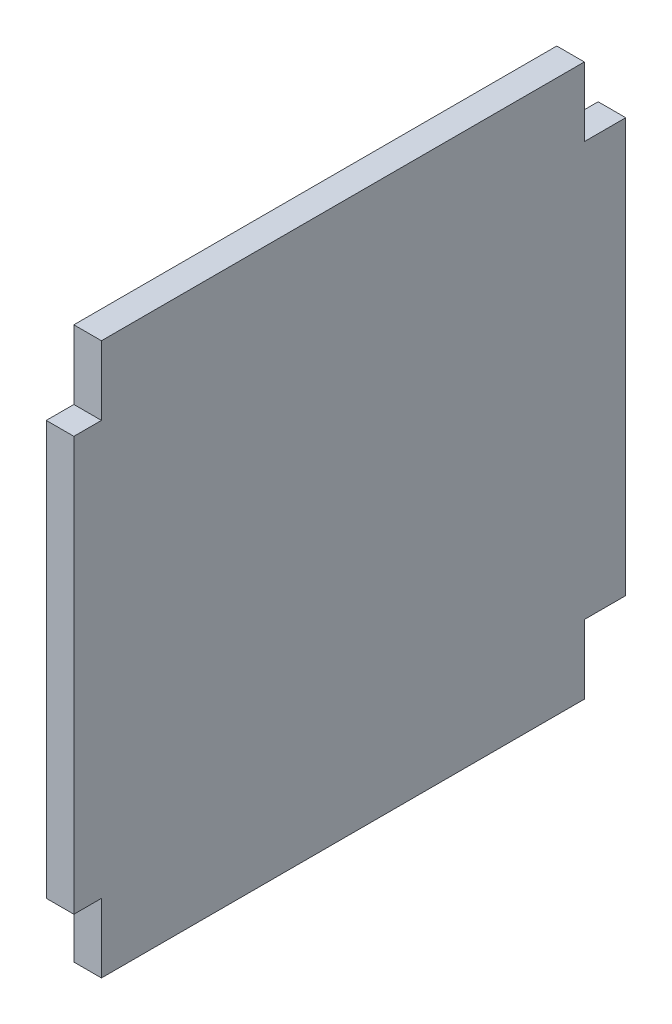
ISO-10303-21;
HEADER;
FILE_DESCRIPTION(('STEP AP214'),'2;1');
FILE_NAME('part.step','',(''),(''),'','','');
FILE_SCHEMA(('AUTOMOTIVE_DESIGN { 1 0 10303 214 1 1 1 1 }'));
ENDSEC;
DATA;
#1=APPLICATION_CONTEXT('core data for automotive mechanical design processes');
#2=APPLICATION_PROTOCOL_DEFINITION('international standard','automotive_design',2000,#1);
#3=PRODUCT_CONTEXT('',#1,'mechanical');
#4=PRODUCT('Part','Part','',(#3));
#5=PRODUCT_RELATED_PRODUCT_CATEGORY('part','',(#4));
#6=PRODUCT_DEFINITION_FORMATION('','',#4);
#7=PRODUCT_DEFINITION_CONTEXT('part definition',#1,'design');
#8=PRODUCT_DEFINITION('design','',#6,#7);
#9=PRODUCT_DEFINITION_SHAPE('','',#8);
#10=(LENGTH_UNIT() NAMED_UNIT(*) SI_UNIT(.MILLI.,.METRE.));
#11=(NAMED_UNIT(*) PLANE_ANGLE_UNIT() SI_UNIT($,.RADIAN.));
#12=(NAMED_UNIT(*) SI_UNIT($,.STERADIAN.) SOLID_ANGLE_UNIT());
#13=UNCERTAINTY_MEASURE_WITH_UNIT(LENGTH_MEASURE(1.E-05),#10,'distance_accuracy_value','');
#14=(GEOMETRIC_REPRESENTATION_CONTEXT(3) GLOBAL_UNCERTAINTY_ASSIGNED_CONTEXT((#13)) GLOBAL_UNIT_ASSIGNED_CONTEXT((#10,
#11,#12)) REPRESENTATION_CONTEXT('',''));
#15=CARTESIAN_POINT('',(0.,0.,0.));
#16=DIRECTION('',(0.,0.,1.));
#17=DIRECTION('',(1.,0.,0.));
#18=AXIS2_PLACEMENT_3D('',#15,#16,#17);
#19=CARTESIAN_POINT('',(214.,15.,67.0665927567458));
#20=DIRECTION('',(0.,-1.,0.));
#21=DIRECTION('',(0.,0.,-1.));
#22=AXIS2_PLACEMENT_3D('',#19,#20,#21);
#23=PLANE('',#22);
#24=DIRECTION('',(0.,0.,-1.));
#25=VECTOR('',#24,1.);
#26=CARTESIAN_POINT('',(216.,15.,67.0665927567458));
#27=LINE('',#26,#25);
#28=CARTESIAN_POINT('',(216.,15.,37.));
#29=VERTEX_POINT('',#28);
#30=CARTESIAN_POINT('',(216.,15.,35.));
#31=VERTEX_POINT('',#30);
#32=EDGE_CURVE('E174',#29,#31,#27,.T.);
#33=ORIENTED_EDGE('',*,*,#32,.T.);
#34=DIRECTION('',(-1.,0.,0.));
#35=VECTOR('',#34,1.);
#36=CARTESIAN_POINT('',(216.,15.,35.));
#37=LINE('',#36,#35);
#38=CARTESIAN_POINT('',(214.,15.,35.));
#39=VERTEX_POINT('',#38);
#40=EDGE_CURVE('E142',#31,#39,#37,.T.);
#41=ORIENTED_EDGE('',*,*,#40,.T.);
#42=DIRECTION('',(0.,0.,-1.));
#43=VECTOR('',#42,1.);
#44=CARTESIAN_POINT('',(214.,15.,67.0665927567458));
#45=LINE('',#44,#43);
#46=CARTESIAN_POINT('',(214.,15.,37.));
#47=VERTEX_POINT('',#46);
#48=EDGE_CURVE('E201',#47,#39,#45,.T.);
#49=ORIENTED_EDGE('',*,*,#48,.F.);
#50=DIRECTION('',(-1.,0.,0.));
#51=VECTOR('',#50,1.);
#52=CARTESIAN_POINT('',(214.,15.,37.));
#53=LINE('',#52,#51);
#54=EDGE_CURVE('E181',#29,#47,#53,.T.);
#55=ORIENTED_EDGE('',*,*,#54,.F.);
#56=EDGE_LOOP('',(#33,#41,#49,#55));
#57=FACE_BOUND('',#56,.T.);
#58=ADVANCED_FACE('F33',(#57),#23,.F.);
#59=CARTESIAN_POINT('',(214.,-15.,67.0665927567458));
#60=DIRECTION('',(0.,1.,0.));
#61=DIRECTION('',(0.,0.,1.));
#62=AXIS2_PLACEMENT_3D('',#59,#60,#61);
#63=PLANE('',#62);
#64=DIRECTION('',(1.,0.,0.));
#65=VECTOR('',#64,1.);
#66=CARTESIAN_POINT('',(216.,-15.,0.));
#67=LINE('',#66,#65);
#68=CARTESIAN_POINT('',(214.,-15.,0.));
#69=VERTEX_POINT('',#68);
#70=CARTESIAN_POINT('',(216.,-15.,0.));
#71=VERTEX_POINT('',#70);
#72=EDGE_CURVE('E230',#69,#71,#67,.T.);
#73=ORIENTED_EDGE('',*,*,#72,.F.);
#74=DIRECTION('',(0.,0.,-1.));
#75=VECTOR('',#74,1.);
#76=CARTESIAN_POINT('',(214.,-15.,67.0665927567458));
#77=LINE('',#76,#75);
#78=CARTESIAN_POINT('',(214.,-15.,-3.));
#79=VERTEX_POINT('',#78);
#80=EDGE_CURVE('E202',#69,#79,#77,.T.);
#81=ORIENTED_EDGE('',*,*,#80,.T.);
#82=DIRECTION('',(-1.,0.,0.));
#83=VECTOR('',#82,1.);
#84=CARTESIAN_POINT('',(214.,-15.,-3.));
#85=LINE('',#84,#83);
#86=CARTESIAN_POINT('',(216.,-15.,-3.));
#87=VERTEX_POINT('',#86);
#88=EDGE_CURVE('E205',#87,#79,#85,.T.);
#89=ORIENTED_EDGE('',*,*,#88,.F.);
#90=DIRECTION('',(0.,0.,-1.));
#91=VECTOR('',#90,1.);
#92=CARTESIAN_POINT('',(216.,-15.,67.0665927567458));
#93=LINE('',#92,#91);
#94=EDGE_CURVE('E58',#71,#87,#93,.T.);
#95=ORIENTED_EDGE('',*,*,#94,.F.);
#96=EDGE_LOOP('',(#73,#81,#89,#95));
#97=FACE_BOUND('',#96,.T.);
#98=ADVANCED_FACE('F274',(#97),#63,.F.);
#99=DIRECTION('',(-1.,0.,0.));
#100=VECTOR('',#99,1.);
#101=CARTESIAN_POINT('',(216.,-15.,35.));
#102=LINE('',#101,#100);
#103=CARTESIAN_POINT('',(216.,-15.,35.));
#104=VERTEX_POINT('',#103);
#105=CARTESIAN_POINT('',(214.,-15.,35.));
#106=VERTEX_POINT('',#105);
#107=EDGE_CURVE('E131',#104,#106,#102,.T.);
#108=ORIENTED_EDGE('',*,*,#107,.F.);
#109=CARTESIAN_POINT('',(216.,-15.,37.));
#110=VERTEX_POINT('',#109);
#111=EDGE_CURVE('E185',#110,#104,#93,.T.);
#112=ORIENTED_EDGE('',*,*,#111,.F.);
#113=DIRECTION('',(1.,0.,0.));
#114=VECTOR('',#113,1.);
#115=CARTESIAN_POINT('',(214.,-15.,37.));
#116=LINE('',#115,#114);
#117=CARTESIAN_POINT('',(214.,-15.,37.));
#118=VERTEX_POINT('',#117);
#119=EDGE_CURVE('E42',#118,#110,#116,.T.);
#120=ORIENTED_EDGE('',*,*,#119,.F.);
#121=EDGE_CURVE('E198',#118,#106,#77,.T.);
#122=ORIENTED_EDGE('',*,*,#121,.T.);
#123=EDGE_LOOP('',(#108,#112,#120,#122));
#124=FACE_BOUND('',#123,.T.);
#125=ADVANCED_FACE('F283',(#124),#63,.F.);
#126=CARTESIAN_POINT('',(214.,15.,67.0665927567458));
#127=DIRECTION('',(1.,0.,0.));
#128=DIRECTION('',(0.,0.,-1.));
#129=AXIS2_PLACEMENT_3D('',#126,#127,#128);
#130=PLANE('',#129);
#131=DIRECTION('',(0.,-1.,0.));
#132=VECTOR('',#131,1.);
#133=CARTESIAN_POINT('',(214.,15.,37.));
#134=LINE('',#133,#132);
#135=EDGE_CURVE('E183',#47,#118,#134,.T.);
#136=ORIENTED_EDGE('',*,*,#135,.F.);
#137=ORIENTED_EDGE('',*,*,#48,.T.);
#138=DIRECTION('',(0.,-1.,0.));
#139=VECTOR('',#138,1.);
#140=CARTESIAN_POINT('',(214.,20.,35.));
#141=LINE('',#140,#139);
#142=CARTESIAN_POINT('',(214.,20.,35.));
#143=VERTEX_POINT('',#142);
#144=EDGE_CURVE('E165',#143,#39,#141,.T.);
#145=ORIENTED_EDGE('',*,*,#144,.F.);
#146=DIRECTION('',(0.,0.,-1.));
#147=VECTOR('',#146,1.);
#148=CARTESIAN_POINT('',(214.,20.,0.));
#149=LINE('',#148,#147);
#150=CARTESIAN_POINT('',(214.,20.,0.));
#151=VERTEX_POINT('',#150);
#152=EDGE_CURVE('E145',#143,#151,#149,.T.);
#153=ORIENTED_EDGE('',*,*,#152,.T.);
#154=DIRECTION('',(0.,-1.,0.));
#155=VECTOR('',#154,1.);
#156=CARTESIAN_POINT('',(214.,20.,0.));
#157=LINE('',#156,#155);
#158=CARTESIAN_POINT('',(214.,15.,0.));
#159=VERTEX_POINT('',#158);
#160=EDGE_CURVE('E132',#151,#159,#157,.T.);
#161=ORIENTED_EDGE('',*,*,#160,.T.);
#162=CARTESIAN_POINT('',(214.,15.,-3.));
#163=VERTEX_POINT('',#162);
#164=EDGE_CURVE('E158',#159,#163,#45,.T.);
#165=ORIENTED_EDGE('',*,*,#164,.T.);
#166=DIRECTION('',(0.,1.,0.));
#167=VECTOR('',#166,1.);
#168=CARTESIAN_POINT('',(214.,15.,-3.));
#169=LINE('',#168,#167);
#170=EDGE_CURVE('E210',#79,#163,#169,.T.);
#171=ORIENTED_EDGE('',*,*,#170,.F.);
#172=ORIENTED_EDGE('',*,*,#80,.F.);
#173=DIRECTION('',(0.,1.,0.));
#174=VECTOR('',#173,1.);
#175=CARTESIAN_POINT('',(214.,-20.,0.));
#176=LINE('',#175,#174);
#177=CARTESIAN_POINT('',(214.,-20.,0.));
#178=VERTEX_POINT('',#177);
#179=EDGE_CURVE('E250',#178,#69,#176,.T.);
#180=ORIENTED_EDGE('',*,*,#179,.F.);
#181=DIRECTION('',(0.,0.,-1.));
#182=VECTOR('',#181,1.);
#183=CARTESIAN_POINT('',(214.,-20.,0.));
#184=LINE('',#183,#182);
#185=CARTESIAN_POINT('',(214.,-20.,35.));
#186=VERTEX_POINT('',#185);
#187=EDGE_CURVE('E276',#186,#178,#184,.T.);
#188=ORIENTED_EDGE('',*,*,#187,.F.);
#189=DIRECTION('',(0.,1.,0.));
#190=VECTOR('',#189,1.);
#191=CARTESIAN_POINT('',(214.,-20.,35.));
#192=LINE('',#191,#190);
#193=EDGE_CURVE('E231',#186,#106,#192,.T.);
#194=ORIENTED_EDGE('',*,*,#193,.T.);
#195=ORIENTED_EDGE('',*,*,#121,.F.);
#196=EDGE_LOOP('',(#136,#137,#145,#153,#161,#165,#171,#172,#180,#188,#194,#195));
#197=FACE_BOUND('',#196,.T.);
#198=ADVANCED_FACE('F275',(#197),#130,.F.);
#199=CARTESIAN_POINT('',(216.,15.,67.0665927567458));
#200=DIRECTION('',(-1.,0.,0.));
#201=DIRECTION('',(0.,0.,1.));
#202=AXIS2_PLACEMENT_3D('',#199,#200,#201);
#203=PLANE('',#202);
#204=DIRECTION('',(0.,1.,0.));
#205=VECTOR('',#204,1.);
#206=CARTESIAN_POINT('',(216.,15.,37.));
#207=LINE('',#206,#205);
#208=EDGE_CURVE('E11',#110,#29,#207,.T.);
#209=ORIENTED_EDGE('',*,*,#208,.F.);
#210=ORIENTED_EDGE('',*,*,#111,.T.);
#211=DIRECTION('',(0.,1.,0.));
#212=VECTOR('',#211,1.);
#213=CARTESIAN_POINT('',(216.,-20.,35.));
#214=LINE('',#213,#212);
#215=CARTESIAN_POINT('',(216.,-20.,35.));
#216=VERTEX_POINT('',#215);
#217=EDGE_CURVE('E257',#216,#104,#214,.T.);
#218=ORIENTED_EDGE('',*,*,#217,.F.);
#219=DIRECTION('',(0.,0.,1.));
#220=VECTOR('',#219,1.);
#221=CARTESIAN_POINT('',(216.,-20.,0.));
#222=LINE('',#221,#220);
#223=CARTESIAN_POINT('',(216.,-20.,0.));
#224=VERTEX_POINT('',#223);
#225=EDGE_CURVE('E244',#224,#216,#222,.T.);
#226=ORIENTED_EDGE('',*,*,#225,.F.);
#227=DIRECTION('',(0.,1.,0.));
#228=VECTOR('',#227,1.);
#229=CARTESIAN_POINT('',(216.,-20.,0.));
#230=LINE('',#229,#228);
#231=EDGE_CURVE('E247',#224,#71,#230,.T.);
#232=ORIENTED_EDGE('',*,*,#231,.T.);
#233=ORIENTED_EDGE('',*,*,#94,.T.);
#234=DIRECTION('',(0.,-1.,0.));
#235=VECTOR('',#234,1.);
#236=CARTESIAN_POINT('',(216.,15.,-3.));
#237=LINE('',#236,#235);
#238=CARTESIAN_POINT('',(216.,15.,-3.));
#239=VERTEX_POINT('',#238);
#240=EDGE_CURVE('E240',#239,#87,#237,.T.);
#241=ORIENTED_EDGE('',*,*,#240,.F.);
#242=CARTESIAN_POINT('',(216.,15.,0.));
#243=VERTEX_POINT('',#242);
#244=EDGE_CURVE('E130',#243,#239,#27,.T.);
#245=ORIENTED_EDGE('',*,*,#244,.F.);
#246=DIRECTION('',(0.,-1.,0.));
#247=VECTOR('',#246,1.);
#248=CARTESIAN_POINT('',(216.,20.,0.));
#249=LINE('',#248,#247);
#250=CARTESIAN_POINT('',(216.,20.,0.));
#251=VERTEX_POINT('',#250);
#252=EDGE_CURVE('E50',#251,#243,#249,.T.);
#253=ORIENTED_EDGE('',*,*,#252,.F.);
#254=DIRECTION('',(0.,0.,1.));
#255=VECTOR('',#254,1.);
#256=CARTESIAN_POINT('',(216.,20.,0.));
#257=LINE('',#256,#255);
#258=CARTESIAN_POINT('',(216.,20.,35.));
#259=VERTEX_POINT('',#258);
#260=EDGE_CURVE('E127',#251,#259,#257,.T.);
#261=ORIENTED_EDGE('',*,*,#260,.T.);
#262=DIRECTION('',(0.,-1.,0.));
#263=VECTOR('',#262,1.);
#264=CARTESIAN_POINT('',(216.,20.,35.));
#265=LINE('',#264,#263);
#266=EDGE_CURVE('E150',#259,#31,#265,.T.);
#267=ORIENTED_EDGE('',*,*,#266,.T.);
#268=ORIENTED_EDGE('',*,*,#32,.F.);
#269=EDGE_LOOP('',(#209,#210,#218,#226,#232,#233,#241,#245,#253,#261,#267,#268));
#270=FACE_BOUND('',#269,.T.);
#271=ADVANCED_FACE('F126',(#270),#203,.F.);
#272=ORIENTED_EDGE('',*,*,#164,.F.);
#273=DIRECTION('',(1.,0.,0.));
#274=VECTOR('',#273,1.);
#275=CARTESIAN_POINT('',(216.,15.,0.));
#276=LINE('',#275,#274);
#277=EDGE_CURVE('E156',#159,#243,#276,.T.);
#278=ORIENTED_EDGE('',*,*,#277,.T.);
#279=ORIENTED_EDGE('',*,*,#244,.T.);
#280=DIRECTION('',(1.,0.,0.));
#281=VECTOR('',#280,1.);
#282=CARTESIAN_POINT('',(214.,15.,-3.));
#283=LINE('',#282,#281);
#284=EDGE_CURVE('E214',#163,#239,#283,.T.);
#285=ORIENTED_EDGE('',*,*,#284,.F.);
#286=EDGE_LOOP('',(#272,#278,#279,#285));
#287=FACE_BOUND('',#286,.T.);
#288=ADVANCED_FACE('F296',(#287),#23,.F.);
#289=CARTESIAN_POINT('',(144.,0.,37.));
#290=DIRECTION('',(0.,0.,1.));
#291=DIRECTION('',(-1.,0.,0.));
#292=AXIS2_PLACEMENT_3D('',#289,#290,#291);
#293=PLANE('',#292);
#294=ORIENTED_EDGE('',*,*,#54,.T.);
#295=ORIENTED_EDGE('',*,*,#135,.T.);
#296=ORIENTED_EDGE('',*,*,#119,.T.);
#297=ORIENTED_EDGE('',*,*,#208,.T.);
#298=EDGE_LOOP('',(#294,#295,#296,#297));
#299=FACE_BOUND('',#298,.T.);
#300=ADVANCED_FACE('F35',(#299),#293,.T.);
#301=CARTESIAN_POINT('',(0.,0.,-3.));
#302=DIRECTION('',(0.,0.,1.));
#303=DIRECTION('',(0.,-1.,0.));
#304=AXIS2_PLACEMENT_3D('',#301,#302,#303);
#305=PLANE('',#304);
#306=ORIENTED_EDGE('',*,*,#170,.T.);
#307=ORIENTED_EDGE('',*,*,#284,.T.);
#308=ORIENTED_EDGE('',*,*,#240,.T.);
#309=ORIENTED_EDGE('',*,*,#88,.T.);
#310=EDGE_LOOP('',(#306,#307,#308,#309));
#311=FACE_BOUND('',#310,.T.);
#312=ADVANCED_FACE('F267',(#311),#305,.F.);
#313=CARTESIAN_POINT('',(216.,-20.,35.));
#314=DIRECTION('',(0.,0.,-1.));
#315=DIRECTION('',(-1.,0.,0.));
#316=AXIS2_PLACEMENT_3D('',#313,#314,#315);
#317=PLANE('',#316);
#318=ORIENTED_EDGE('',*,*,#107,.T.);
#319=ORIENTED_EDGE('',*,*,#193,.F.);
#320=DIRECTION('',(-1.,0.,0.));
#321=VECTOR('',#320,1.);
#322=CARTESIAN_POINT('',(216.,-20.,35.));
#323=LINE('',#322,#321);
#324=EDGE_CURVE('E278',#216,#186,#323,.T.);
#325=ORIENTED_EDGE('',*,*,#324,.F.);
#326=ORIENTED_EDGE('',*,*,#217,.T.);
#327=EDGE_LOOP('',(#318,#319,#325,#326));
#328=FACE_BOUND('',#327,.T.);
#329=ADVANCED_FACE('F285',(#328),#317,.F.);
#330=CARTESIAN_POINT('',(216.,-20.,0.));
#331=DIRECTION('',(0.,0.,1.));
#332=DIRECTION('',(1.,0.,0.));
#333=AXIS2_PLACEMENT_3D('',#330,#331,#332);
#334=PLANE('',#333);
#335=ORIENTED_EDGE('',*,*,#72,.T.);
#336=ORIENTED_EDGE('',*,*,#231,.F.);
#337=DIRECTION('',(1.,0.,0.));
#338=VECTOR('',#337,1.);
#339=CARTESIAN_POINT('',(216.,-20.,0.));
#340=LINE('',#339,#338);
#341=EDGE_CURVE('E236',#178,#224,#340,.T.);
#342=ORIENTED_EDGE('',*,*,#341,.F.);
#343=ORIENTED_EDGE('',*,*,#179,.T.);
#344=EDGE_LOOP('',(#335,#336,#342,#343));
#345=FACE_BOUND('',#344,.T.);
#346=ADVANCED_FACE('F272',(#345),#334,.F.);
#347=CARTESIAN_POINT('',(0.,-20.,0.));
#348=DIRECTION('',(0.,-1.,0.));
#349=DIRECTION('',(0.,0.,-1.));
#350=AXIS2_PLACEMENT_3D('',#347,#348,#349);
#351=PLANE('',#350);
#352=ORIENTED_EDGE('',*,*,#225,.T.);
#353=ORIENTED_EDGE('',*,*,#324,.T.);
#354=ORIENTED_EDGE('',*,*,#187,.T.);
#355=ORIENTED_EDGE('',*,*,#341,.T.);
#356=EDGE_LOOP('',(#352,#353,#354,#355));
#357=FACE_BOUND('',#356,.T.);
#358=ADVANCED_FACE('F280',(#357),#351,.T.);
#359=CARTESIAN_POINT('',(216.,20.,0.));
#360=DIRECTION('',(0.,0.,-1.));
#361=DIRECTION('',(-1.,0.,0.));
#362=AXIS2_PLACEMENT_3D('',#359,#360,#361);
#363=PLANE('',#362);
#364=ORIENTED_EDGE('',*,*,#277,.F.);
#365=ORIENTED_EDGE('',*,*,#160,.F.);
#366=DIRECTION('',(1.,0.,0.));
#367=VECTOR('',#366,1.);
#368=CARTESIAN_POINT('',(216.,20.,0.));
#369=LINE('',#368,#367);
#370=EDGE_CURVE('E138',#151,#251,#369,.T.);
#371=ORIENTED_EDGE('',*,*,#370,.T.);
#372=ORIENTED_EDGE('',*,*,#252,.T.);
#373=EDGE_LOOP('',(#364,#365,#371,#372));
#374=FACE_BOUND('',#373,.T.);
#375=ADVANCED_FACE('F144',(#374),#363,.T.);
#376=CARTESIAN_POINT('',(216.,20.,35.));
#377=DIRECTION('',(0.,0.,1.));
#378=DIRECTION('',(1.,0.,0.));
#379=AXIS2_PLACEMENT_3D('',#376,#377,#378);
#380=PLANE('',#379);
#381=ORIENTED_EDGE('',*,*,#40,.F.);
#382=ORIENTED_EDGE('',*,*,#266,.F.);
#383=DIRECTION('',(-1.,0.,0.));
#384=VECTOR('',#383,1.);
#385=CARTESIAN_POINT('',(216.,20.,35.));
#386=LINE('',#385,#384);
#387=EDGE_CURVE('E141',#259,#143,#386,.T.);
#388=ORIENTED_EDGE('',*,*,#387,.T.);
#389=ORIENTED_EDGE('',*,*,#144,.T.);
#390=EDGE_LOOP('',(#381,#382,#388,#389));
#391=FACE_BOUND('',#390,.T.);
#392=ADVANCED_FACE('F177',(#391),#380,.T.);
#393=CARTESIAN_POINT('',(0.,20.,0.));
#394=DIRECTION('',(0.,1.,0.));
#395=DIRECTION('',(0.,0.,-1.));
#396=AXIS2_PLACEMENT_3D('',#393,#394,#395);
#397=PLANE('',#396);
#398=ORIENTED_EDGE('',*,*,#260,.F.);
#399=ORIENTED_EDGE('',*,*,#370,.F.);
#400=ORIENTED_EDGE('',*,*,#152,.F.);
#401=ORIENTED_EDGE('',*,*,#387,.F.);
#402=EDGE_LOOP('',(#398,#399,#400,#401));
#403=FACE_BOUND('',#402,.T.);
#404=ADVANCED_FACE('F136',(#403),#397,.T.);
#405=CLOSED_SHELL('',(#58,#98,#125,#198,#271,#288,#300,#312,#329,#346,#358,#375,#392,#404));
#406=MANIFOLD_SOLID_BREP('B2',#405);
#407=ADVANCED_BREP_SHAPE_REPRESENTATION('',(#18,#406),#14);
#408=SHAPE_DEFINITION_REPRESENTATION(#9,#407);
ENDSEC;
END-ISO-10303-21;
